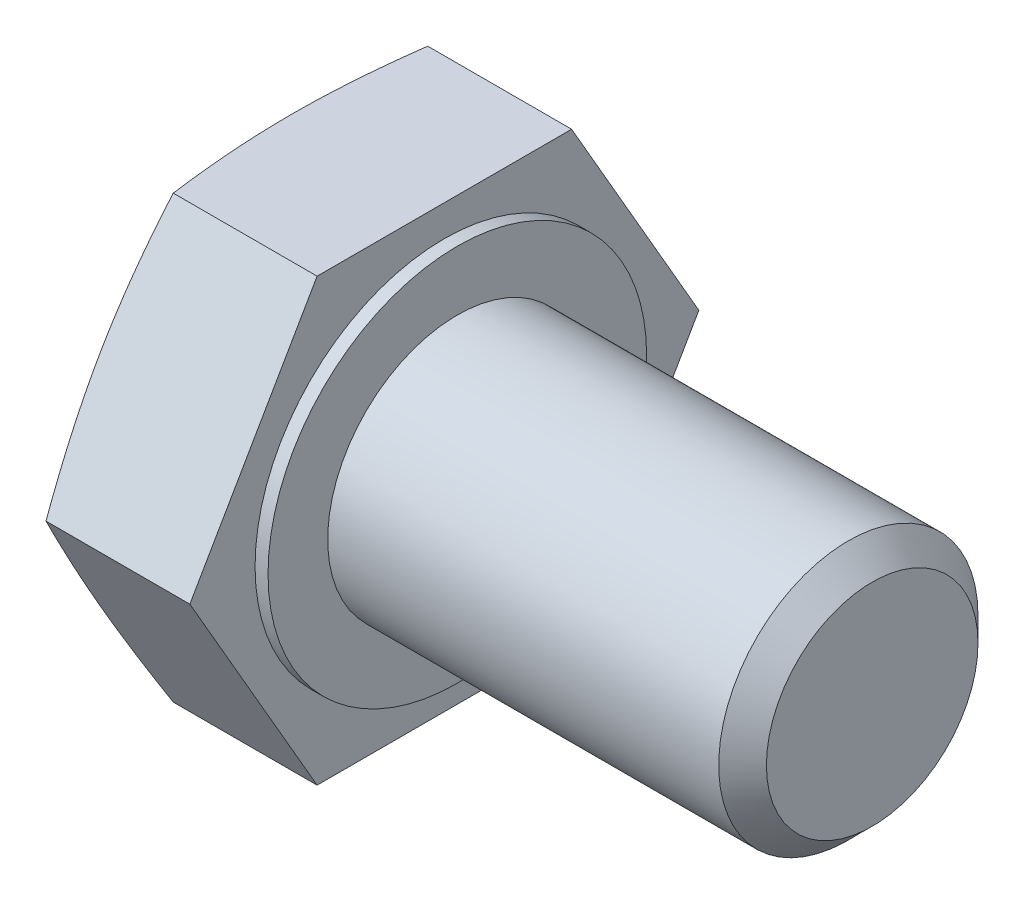
ISO-10303-21;
HEADER;
FILE_DESCRIPTION(('STEP AP214'),'2;1');
FILE_NAME('part.step','',(''),(''),'','','');
FILE_SCHEMA(('AUTOMOTIVE_DESIGN { 1 0 10303 214 1 1 1 1 }'));
ENDSEC;
DATA;
#1=APPLICATION_CONTEXT('core data for automotive mechanical design processes');
#2=APPLICATION_PROTOCOL_DEFINITION('international standard','automotive_design',2000,#1);
#3=PRODUCT_CONTEXT('',#1,'mechanical');
#4=PRODUCT('Part','Part','',(#3));
#5=PRODUCT_RELATED_PRODUCT_CATEGORY('part','',(#4));
#6=PRODUCT_DEFINITION_FORMATION('','',#4);
#7=PRODUCT_DEFINITION_CONTEXT('part definition',#1,'design');
#8=PRODUCT_DEFINITION('design','',#6,#7);
#9=PRODUCT_DEFINITION_SHAPE('','',#8);
#10=(LENGTH_UNIT() NAMED_UNIT(*) SI_UNIT(.MILLI.,.METRE.));
#11=(NAMED_UNIT(*) PLANE_ANGLE_UNIT() SI_UNIT($,.RADIAN.));
#12=(NAMED_UNIT(*) SI_UNIT($,.STERADIAN.) SOLID_ANGLE_UNIT());
#13=UNCERTAINTY_MEASURE_WITH_UNIT(LENGTH_MEASURE(1.E-05),#10,'distance_accuracy_value','');
#14=(GEOMETRIC_REPRESENTATION_CONTEXT(3) GLOBAL_UNCERTAINTY_ASSIGNED_CONTEXT((#13)) GLOBAL_UNIT_ASSIGNED_CONTEXT((#10,
#11,#12)) REPRESENTATION_CONTEXT('',''));
#15=CARTESIAN_POINT('',(0.,0.,0.));
#16=DIRECTION('',(0.,0.,1.));
#17=DIRECTION('',(1.,0.,0.));
#18=AXIS2_PLACEMENT_3D('',#15,#16,#17);
#19=CARTESIAN_POINT('',(-6.4,0.,0.));
#20=DIRECTION('',(1.,0.,0.));
#21=DIRECTION('',(0.,0.,-1.));
#22=AXIS2_PLACEMENT_3D('',#19,#20,#21);
#23=CONICAL_SURFACE('',#22,8.5,1.30899693899575);
#24=CARTESIAN_POINT('',(-6.04765898321727,-8.5,4.90747728811182));
#25=CARTESIAN_POINT('',(-6.4,-8.5,2.2775681356645));
#26=CARTESIAN_POINT('',(-6.4,-8.5,0.));
#27=B_SPLINE_CURVE_WITH_KNOTS('',2,(#24,#25,#26),.UNSPECIFIED.,.F.,.F.,(3,3),(0.,1.),.UNSPECIFIED.);
#28=CARTESIAN_POINT('',(-6.04765898321727,-8.5,4.90747728811182));
#29=VERTEX_POINT('',#28);
#30=CARTESIAN_POINT('',(-6.4,-8.5,0.));
#31=VERTEX_POINT('',#30);
#32=EDGE_CURVE('E135',#29,#31,#27,.T.);
#33=ORIENTED_EDGE('',*,*,#32,.F.);
#34=CARTESIAN_POINT('',(-6.4,-4.25,7.36121593216773));
#35=CARTESIAN_POINT('',(-6.4,-6.22243186433654,6.22243186433484));
#36=CARTESIAN_POINT('',(-6.04765898321744,-8.5,4.90747728811182));
#37=B_SPLINE_CURVE_WITH_KNOTS('',2,(#34,#35,#36),.UNSPECIFIED.,.F.,.F.,(3,3),(0.,1.),.UNSPECIFIED.);
#38=CARTESIAN_POINT('',(-6.4,-4.25,7.36121593216773));
#39=VERTEX_POINT('',#38);
#40=EDGE_CURVE('E139',#39,#29,#37,.T.);
#41=ORIENTED_EDGE('',*,*,#40,.F.);
#42=CARTESIAN_POINT('',(-6.4,0.,0.));
#43=DIRECTION('',(1.,0.,0.));
#44=DIRECTION('',(0.,0.,-1.));
#45=AXIS2_PLACEMENT_3D('',#42,#43,#44);
#46=CIRCLE('',#45,8.5);
#47=EDGE_CURVE('E9',#39,#31,#46,.T.);
#48=ORIENTED_EDGE('',*,*,#47,.T.);
#49=EDGE_LOOP('',(#33,#41,#48));
#50=FACE_BOUND('',#49,.T.);
#51=ADVANCED_FACE('F15',(#50),#23,.T.);
#52=CARTESIAN_POINT('',(-6.4,0.,0.));
#53=DIRECTION('',(1.,0.,0.));
#54=DIRECTION('',(0.,1.,0.));
#55=AXIS2_PLACEMENT_3D('',#52,#53,#54);
#56=PLANE('',#55);
#57=CARTESIAN_POINT('',(-6.4,0.,0.));
#58=DIRECTION('',(1.,0.,0.));
#59=DIRECTION('',(0.,0.,-1.));
#60=AXIS2_PLACEMENT_3D('',#57,#58,#59);
#61=CIRCLE('',#60,8.5);
#62=CARTESIAN_POINT('',(-6.4,8.5,0.));
#63=VERTEX_POINT('',#62);
#64=CARTESIAN_POINT('',(-6.4,4.25,7.36121593216773));
#65=VERTEX_POINT('',#64);
#66=EDGE_CURVE('E199',#63,#65,#61,.T.);
#67=ORIENTED_EDGE('',*,*,#66,.F.);
#68=CARTESIAN_POINT('',(-6.4,0.,0.));
#69=DIRECTION('',(1.,0.,0.));
#70=DIRECTION('',(0.,0.,-1.));
#71=AXIS2_PLACEMENT_3D('',#68,#69,#70);
#72=CIRCLE('',#71,8.5);
#73=CARTESIAN_POINT('',(-6.4,4.25,-7.36121593216773));
#74=VERTEX_POINT('',#73);
#75=EDGE_CURVE('E25',#74,#63,#72,.T.);
#76=ORIENTED_EDGE('',*,*,#75,.F.);
#77=CARTESIAN_POINT('',(-6.4,0.,0.));
#78=DIRECTION('',(1.,0.,0.));
#79=DIRECTION('',(0.,0.,-1.));
#80=AXIS2_PLACEMENT_3D('',#77,#78,#79);
#81=CIRCLE('',#80,8.5);
#82=CARTESIAN_POINT('',(-6.4,-4.25,-7.36121593216773));
#83=VERTEX_POINT('',#82);
#84=EDGE_CURVE('E260',#83,#74,#81,.T.);
#85=ORIENTED_EDGE('',*,*,#84,.F.);
#86=CARTESIAN_POINT('',(-6.4,0.,0.));
#87=DIRECTION('',(1.,0.,0.));
#88=DIRECTION('',(0.,0.,-1.));
#89=AXIS2_PLACEMENT_3D('',#86,#87,#88);
#90=CIRCLE('',#89,8.5);
#91=EDGE_CURVE('E404',#31,#83,#90,.T.);
#92=ORIENTED_EDGE('',*,*,#91,.F.);
#93=ORIENTED_EDGE('',*,*,#47,.F.);
#94=CARTESIAN_POINT('',(-6.4,0.,0.));
#95=DIRECTION('',(1.,0.,0.));
#96=DIRECTION('',(0.,0.,-1.));
#97=AXIS2_PLACEMENT_3D('',#94,#95,#96);
#98=CIRCLE('',#97,8.5);
#99=EDGE_CURVE('E207',#65,#39,#98,.T.);
#100=ORIENTED_EDGE('',*,*,#99,.F.);
#101=EDGE_LOOP('',(#67,#76,#85,#92,#93,#100));
#102=FACE_BOUND('',#101,.T.);
#103=ADVANCED_FACE('F334',(#102),#56,.F.);
#104=CARTESIAN_POINT('',(-6.4,0.,0.));
#105=DIRECTION('',(1.,0.,0.));
#106=DIRECTION('',(0.,0.,-1.));
#107=AXIS2_PLACEMENT_3D('',#104,#105,#106);
#108=CONICAL_SURFACE('',#107,8.5,1.30899693899575);
#109=CARTESIAN_POINT('',(-6.4,4.25,-7.36121593216773));
#110=CARTESIAN_POINT('',(-6.4,6.22243186433654,-6.22243186433484));
#111=CARTESIAN_POINT('',(-6.04765898321744,8.5,-4.90747728811182));
#112=B_SPLINE_CURVE_WITH_KNOTS('',2,(#109,#110,#111),.UNSPECIFIED.,.F.,.F.,(3,3),(0.,1.),.UNSPECIFIED.);
#113=CARTESIAN_POINT('',(-6.04765898321727,8.5,-4.90747728811182));
#114=VERTEX_POINT('',#113);
#115=EDGE_CURVE('E298',#74,#114,#112,.T.);
#116=ORIENTED_EDGE('',*,*,#115,.F.);
#117=ORIENTED_EDGE('',*,*,#75,.T.);
#118=CARTESIAN_POINT('',(-6.04765898321727,8.5,-4.90747728811182));
#119=CARTESIAN_POINT('',(-6.4,8.5,-2.2775681356645));
#120=CARTESIAN_POINT('',(-6.4,8.5,0.));
#121=B_SPLINE_CURVE_WITH_KNOTS('',2,(#118,#119,#120),.UNSPECIFIED.,.F.,.F.,(3,3),(0.,1.),.UNSPECIFIED.);
#122=EDGE_CURVE('E268',#114,#63,#121,.T.);
#123=ORIENTED_EDGE('',*,*,#122,.F.);
#124=EDGE_LOOP('',(#116,#117,#123));
#125=FACE_BOUND('',#124,.T.);
#126=ADVANCED_FACE('F325',(#125),#108,.T.);
#127=CARTESIAN_POINT('',(-6.4,0.,0.));
#128=DIRECTION('',(1.,0.,0.));
#129=DIRECTION('',(0.,0.,-1.));
#130=AXIS2_PLACEMENT_3D('',#127,#128,#129);
#131=CONICAL_SURFACE('',#130,8.5,1.30899693899575);
#132=CARTESIAN_POINT('',(-6.4,-4.25,-7.36121593216773));
#133=CARTESIAN_POINT('',(-6.4,-2.27756813566346,-8.50000000000062));
#134=CARTESIAN_POINT('',(-6.04765898321744,0.,-9.81495457622364));
#135=B_SPLINE_CURVE_WITH_KNOTS('',2,(#132,#133,#134),.UNSPECIFIED.,.F.,.F.,(3,3),(0.,1.),.UNSPECIFIED.);
#136=CARTESIAN_POINT('',(-6.04765898321727,0.,-9.81495457622364));
#137=VERTEX_POINT('',#136);
#138=EDGE_CURVE('E418',#83,#137,#135,.T.);
#139=ORIENTED_EDGE('',*,*,#138,.F.);
#140=ORIENTED_EDGE('',*,*,#84,.T.);
#141=CARTESIAN_POINT('',(-6.04765898321744,0.,-9.81495457622364));
#142=CARTESIAN_POINT('',(-6.4,2.27756813566346,-8.50000000000063));
#143=CARTESIAN_POINT('',(-6.4,4.25,-7.36121593216773));
#144=B_SPLINE_CURVE_WITH_KNOTS('',2,(#141,#142,#143),.UNSPECIFIED.,.F.,.F.,(3,3),(0.,1.),.UNSPECIFIED.);
#145=EDGE_CURVE('E301',#137,#74,#144,.T.);
#146=ORIENTED_EDGE('',*,*,#145,.F.);
#147=EDGE_LOOP('',(#139,#140,#146));
#148=FACE_BOUND('',#147,.T.);
#149=ADVANCED_FACE('F160',(#148),#131,.T.);
#150=CARTESIAN_POINT('',(-6.4,0.,0.));
#151=DIRECTION('',(1.,0.,0.));
#152=DIRECTION('',(0.,0.,-1.));
#153=AXIS2_PLACEMENT_3D('',#150,#151,#152);
#154=CONICAL_SURFACE('',#153,8.5,1.30899693899575);
#155=CARTESIAN_POINT('',(-6.4,-8.5,0.));
#156=CARTESIAN_POINT('',(-6.4,-8.5,-2.27756813566453));
#157=CARTESIAN_POINT('',(-6.04765898321727,-8.5,-4.90747728811181));
#158=B_SPLINE_CURVE_WITH_KNOTS('',2,(#155,#156,#157),.UNSPECIFIED.,.F.,.F.,(3,3),(0.,1.),.UNSPECIFIED.);
#159=CARTESIAN_POINT('',(-6.04765898321727,-8.5,-4.90747728811182));
#160=VERTEX_POINT('',#159);
#161=EDGE_CURVE('E368',#31,#160,#158,.T.);
#162=ORIENTED_EDGE('',*,*,#161,.F.);
#163=ORIENTED_EDGE('',*,*,#91,.T.);
#164=CARTESIAN_POINT('',(-6.04765898321744,-8.5,-4.90747728811182));
#165=CARTESIAN_POINT('',(-6.4,-6.22243186433654,-6.22243186433483));
#166=CARTESIAN_POINT('',(-6.4,-4.25,-7.36121593216773));
#167=B_SPLINE_CURVE_WITH_KNOTS('',2,(#164,#165,#166),.UNSPECIFIED.,.F.,.F.,(3,3),(0.,1.),.UNSPECIFIED.);
#168=EDGE_CURVE('E376',#160,#83,#167,.T.);
#169=ORIENTED_EDGE('',*,*,#168,.F.);
#170=EDGE_LOOP('',(#162,#163,#169));
#171=FACE_BOUND('',#170,.T.);
#172=ADVANCED_FACE('F189',(#171),#154,.T.);
#173=CARTESIAN_POINT('',(-6.4,0.,0.));
#174=DIRECTION('',(1.,0.,0.));
#175=DIRECTION('',(0.,0.,-1.));
#176=AXIS2_PLACEMENT_3D('',#173,#174,#175);
#177=CONICAL_SURFACE('',#176,8.5,1.30899693899575);
#178=CARTESIAN_POINT('',(-6.4,4.25,7.36121593216773));
#179=CARTESIAN_POINT('',(-6.4,2.27756813566346,8.50000000000062));
#180=CARTESIAN_POINT('',(-6.04765898321744,0.,9.81495457622364));
#181=B_SPLINE_CURVE_WITH_KNOTS('',2,(#178,#179,#180),.UNSPECIFIED.,.F.,.F.,(3,3),(0.,1.),.UNSPECIFIED.);
#182=CARTESIAN_POINT('',(-6.04765898321727,0.,9.81495457622364));
#183=VERTEX_POINT('',#182);
#184=EDGE_CURVE('E458',#65,#183,#181,.T.);
#185=ORIENTED_EDGE('',*,*,#184,.F.);
#186=ORIENTED_EDGE('',*,*,#99,.T.);
#187=CARTESIAN_POINT('',(-6.04765898321744,0.,9.81495457622364));
#188=CARTESIAN_POINT('',(-6.4,-2.27756813566346,8.50000000000063));
#189=CARTESIAN_POINT('',(-6.4,-4.25,7.36121593216773));
#190=B_SPLINE_CURVE_WITH_KNOTS('',2,(#187,#188,#189),.UNSPECIFIED.,.F.,.F.,(3,3),(0.,1.),.UNSPECIFIED.);
#191=EDGE_CURVE('E38',#183,#39,#190,.T.);
#192=ORIENTED_EDGE('',*,*,#191,.F.);
#193=EDGE_LOOP('',(#185,#186,#192));
#194=FACE_BOUND('',#193,.T.);
#195=ADVANCED_FACE('F180',(#194),#177,.T.);
#196=CARTESIAN_POINT('',(-6.4,0.,0.));
#197=DIRECTION('',(1.,0.,0.));
#198=DIRECTION('',(0.,0.,-1.));
#199=AXIS2_PLACEMENT_3D('',#196,#197,#198);
#200=CONICAL_SURFACE('',#199,8.5,1.30899693899575);
#201=CARTESIAN_POINT('',(-6.4,8.5,0.));
#202=CARTESIAN_POINT('',(-6.4,8.5,2.27756813566453));
#203=CARTESIAN_POINT('',(-6.04765898321727,8.5,4.90747728811181));
#204=B_SPLINE_CURVE_WITH_KNOTS('',2,(#201,#202,#203),.UNSPECIFIED.,.F.,.F.,(3,3),(0.,1.),.UNSPECIFIED.);
#205=CARTESIAN_POINT('',(-6.04765898321727,8.5,4.90747728811182));
#206=VERTEX_POINT('',#205);
#207=EDGE_CURVE('E295',#63,#206,#204,.T.);
#208=ORIENTED_EDGE('',*,*,#207,.F.);
#209=ORIENTED_EDGE('',*,*,#66,.T.);
#210=CARTESIAN_POINT('',(-6.04765898321744,8.5,4.90747728811182));
#211=CARTESIAN_POINT('',(-6.4,6.22243186433654,6.22243186433483));
#212=CARTESIAN_POINT('',(-6.4,4.25,7.36121593216773));
#213=B_SPLINE_CURVE_WITH_KNOTS('',2,(#210,#211,#212),.UNSPECIFIED.,.F.,.F.,(3,3),(0.,1.),.UNSPECIFIED.);
#214=EDGE_CURVE('E215',#206,#65,#213,.T.);
#215=ORIENTED_EDGE('',*,*,#214,.F.);
#216=EDGE_LOOP('',(#208,#209,#215));
#217=FACE_BOUND('',#216,.T.);
#218=ADVANCED_FACE('F157',(#217),#200,.T.);
#219=CARTESIAN_POINT('',(0.,-8.5,4.90747728811182));
#220=DIRECTION('',(0.,-0.5,0.866025403784439));
#221=DIRECTION('',(-1.,0.,0.));
#222=AXIS2_PLACEMENT_3D('',#219,#220,#221);
#223=PLANE('',#222);
#224=ORIENTED_EDGE('',*,*,#191,.T.);
#225=ORIENTED_EDGE('',*,*,#40,.T.);
#226=DIRECTION('',(-1.,0.,0.));
#227=VECTOR('',#226,1.);
#228=CARTESIAN_POINT('',(0.,-8.5,4.90747728811182));
#229=LINE('',#228,#227);
#230=CARTESIAN_POINT('',(-0.5,-8.5,4.90747728811182));
#231=VERTEX_POINT('',#230);
#232=EDGE_CURVE('E372',#231,#29,#229,.T.);
#233=ORIENTED_EDGE('',*,*,#232,.F.);
#234=DIRECTION('',(0.,0.866025403784439,0.5));
#235=VECTOR('',#234,1.);
#236=CARTESIAN_POINT('',(-0.5,4.3375,12.3192113688336));
#237=LINE('',#236,#235);
#238=CARTESIAN_POINT('',(-0.5,0.,9.81495457622364));
#239=VERTEX_POINT('',#238);
#240=EDGE_CURVE('E117',#231,#239,#237,.T.);
#241=ORIENTED_EDGE('',*,*,#240,.T.);
#242=DIRECTION('',(-1.,0.,0.));
#243=VECTOR('',#242,1.);
#244=CARTESIAN_POINT('',(0.,0.,9.81495457622364));
#245=LINE('',#244,#243);
#246=EDGE_CURVE('E178',#239,#183,#245,.T.);
#247=ORIENTED_EDGE('',*,*,#246,.T.);
#248=EDGE_LOOP('',(#224,#225,#233,#241,#247));
#249=FACE_BOUND('',#248,.T.);
#250=ADVANCED_FACE('F146',(#249),#223,.T.);
#251=CARTESIAN_POINT('',(0.,0.,9.81495457622364));
#252=DIRECTION('',(0.,0.5,0.866025403784439));
#253=DIRECTION('',(1.,0.,0.));
#254=AXIS2_PLACEMENT_3D('',#251,#252,#253);
#255=PLANE('',#254);
#256=ORIENTED_EDGE('',*,*,#214,.T.);
#257=ORIENTED_EDGE('',*,*,#184,.T.);
#258=ORIENTED_EDGE('',*,*,#246,.F.);
#259=DIRECTION('',(0.,0.866025403784439,-0.5));
#260=VECTOR('',#259,1.);
#261=CARTESIAN_POINT('',(-0.5,12.8375,2.40322049550182));
#262=LINE('',#261,#260);
#263=CARTESIAN_POINT('',(-0.5,8.5,4.90747728811182));
#264=VERTEX_POINT('',#263);
#265=EDGE_CURVE('E123',#239,#264,#262,.T.);
#266=ORIENTED_EDGE('',*,*,#265,.T.);
#267=DIRECTION('',(-1.,0.,0.));
#268=VECTOR('',#267,1.);
#269=CARTESIAN_POINT('',(0.,8.5,4.90747728811182));
#270=LINE('',#269,#268);
#271=EDGE_CURVE('E231',#264,#206,#270,.T.);
#272=ORIENTED_EDGE('',*,*,#271,.T.);
#273=EDGE_LOOP('',(#256,#257,#258,#266,#272));
#274=FACE_BOUND('',#273,.T.);
#275=ADVANCED_FACE('F156',(#274),#255,.T.);
#276=CARTESIAN_POINT('',(0.,8.5,4.90747728811182));
#277=DIRECTION('',(0.,1.,0.));
#278=DIRECTION('',(1.,0.,0.));
#279=AXIS2_PLACEMENT_3D('',#276,#277,#278);
#280=PLANE('',#279);
#281=ORIENTED_EDGE('',*,*,#122,.T.);
#282=ORIENTED_EDGE('',*,*,#207,.T.);
#283=ORIENTED_EDGE('',*,*,#271,.F.);
#284=DIRECTION('',(0.,0.,-1.));
#285=VECTOR('',#284,1.);
#286=CARTESIAN_POINT('',(-0.5,8.5,0.));
#287=LINE('',#286,#285);
#288=CARTESIAN_POINT('',(-0.5,8.5,-4.90747728811182));
#289=VERTEX_POINT('',#288);
#290=EDGE_CURVE('E120',#264,#289,#287,.T.);
#291=ORIENTED_EDGE('',*,*,#290,.T.);
#292=DIRECTION('',(-1.,0.,0.));
#293=VECTOR('',#292,1.);
#294=CARTESIAN_POINT('',(0.,8.5,-4.90747728811182));
#295=LINE('',#294,#293);
#296=EDGE_CURVE('E297',#289,#114,#295,.T.);
#297=ORIENTED_EDGE('',*,*,#296,.T.);
#298=EDGE_LOOP('',(#281,#282,#283,#291,#297));
#299=FACE_BOUND('',#298,.T.);
#300=ADVANCED_FACE('F274',(#299),#280,.T.);
#301=CARTESIAN_POINT('',(0.,8.5,-4.90747728811182));
#302=DIRECTION('',(0.,0.5,-0.866025403784439));
#303=DIRECTION('',(-1.,0.,0.));
#304=AXIS2_PLACEMENT_3D('',#301,#302,#303);
#305=PLANE('',#304);
#306=ORIENTED_EDGE('',*,*,#145,.T.);
#307=ORIENTED_EDGE('',*,*,#115,.T.);
#308=ORIENTED_EDGE('',*,*,#296,.F.);
#309=DIRECTION('',(0.,-0.866025403784439,-0.5));
#310=VECTOR('',#309,1.);
#311=CARTESIAN_POINT('',(-0.5,12.8375,-2.40322049550182));
#312=LINE('',#311,#310);
#313=CARTESIAN_POINT('',(-0.5,0.,-9.81495457622364));
#314=VERTEX_POINT('',#313);
#315=EDGE_CURVE('E110',#289,#314,#312,.T.);
#316=ORIENTED_EDGE('',*,*,#315,.T.);
#317=DIRECTION('',(-1.,0.,0.));
#318=VECTOR('',#317,1.);
#319=CARTESIAN_POINT('',(0.,0.,-9.81495457622364));
#320=LINE('',#319,#318);
#321=EDGE_CURVE('E430',#314,#137,#320,.T.);
#322=ORIENTED_EDGE('',*,*,#321,.T.);
#323=EDGE_LOOP('',(#306,#307,#308,#316,#322));
#324=FACE_BOUND('',#323,.T.);
#325=ADVANCED_FACE('F244',(#324),#305,.T.);
#326=CARTESIAN_POINT('',(0.,0.,-9.81495457622364));
#327=DIRECTION('',(0.,-0.5,-0.866025403784439));
#328=DIRECTION('',(0.,-0.866025403784439,0.5));
#329=AXIS2_PLACEMENT_3D('',#326,#327,#328);
#330=PLANE('',#329);
#331=ORIENTED_EDGE('',*,*,#168,.T.);
#332=ORIENTED_EDGE('',*,*,#138,.T.);
#333=ORIENTED_EDGE('',*,*,#321,.F.);
#334=DIRECTION('',(0.,-0.866025403784439,0.5));
#335=VECTOR('',#334,1.);
#336=CARTESIAN_POINT('',(-0.5,4.3375,-12.3192113688336));
#337=LINE('',#336,#335);
#338=CARTESIAN_POINT('',(-0.5,-8.5,-4.90747728811182));
#339=VERTEX_POINT('',#338);
#340=EDGE_CURVE('E107',#314,#339,#337,.T.);
#341=ORIENTED_EDGE('',*,*,#340,.T.);
#342=DIRECTION('',(-1.,0.,0.));
#343=VECTOR('',#342,1.);
#344=CARTESIAN_POINT('',(0.,-8.5,-4.90747728811182));
#345=LINE('',#344,#343);
#346=EDGE_CURVE('E369',#339,#160,#345,.T.);
#347=ORIENTED_EDGE('',*,*,#346,.T.);
#348=EDGE_LOOP('',(#331,#332,#333,#341,#347));
#349=FACE_BOUND('',#348,.T.);
#350=ADVANCED_FACE('F283',(#349),#330,.T.);
#351=CARTESIAN_POINT('',(0.,-8.5,-4.90747728811182));
#352=DIRECTION('',(0.,-1.,0.));
#353=DIRECTION('',(0.,0.,-1.));
#354=AXIS2_PLACEMENT_3D('',#351,#352,#353);
#355=PLANE('',#354);
#356=ORIENTED_EDGE('',*,*,#32,.T.);
#357=ORIENTED_EDGE('',*,*,#161,.T.);
#358=ORIENTED_EDGE('',*,*,#346,.F.);
#359=DIRECTION('',(0.,0.,1.));
#360=VECTOR('',#359,1.);
#361=CARTESIAN_POINT('',(-0.5,-8.5,0.));
#362=LINE('',#361,#360);
#363=EDGE_CURVE('E113',#339,#231,#362,.T.);
#364=ORIENTED_EDGE('',*,*,#363,.T.);
#365=ORIENTED_EDGE('',*,*,#232,.T.);
#366=EDGE_LOOP('',(#356,#357,#358,#364,#365));
#367=FACE_BOUND('',#366,.T.);
#368=ADVANCED_FACE('F343',(#367),#355,.T.);
#369=CARTESIAN_POINT('',(16.,4.08,0.));
#370=DIRECTION('',(-1.,0.,0.));
#371=DIRECTION('',(0.,0.,1.));
#372=AXIS2_PLACEMENT_3D('',#369,#370,#371);
#373=PLANE('',#372);
#374=CARTESIAN_POINT('',(16.,0.,0.));
#375=DIRECTION('',(1.,0.,0.));
#376=DIRECTION('',(0.,0.,-1.));
#377=AXIS2_PLACEMENT_3D('',#374,#375,#376);
#378=CIRCLE('',#377,4.08);
#379=CARTESIAN_POINT('',(16.,0.,-4.08));
#380=VERTEX_POINT('',#379);
#381=EDGE_CURVE('E133',#380,#380,#378,.T.);
#382=ORIENTED_EDGE('',*,*,#381,.T.);
#383=EDGE_LOOP('',(#382));
#384=FACE_BOUND('',#383,.T.);
#385=ADVANCED_FACE('F346',(#384),#373,.F.);
#386=CARTESIAN_POINT('',(15.08,0.,0.));
#387=DIRECTION('',(-1.,0.,0.));
#388=DIRECTION('',(0.,0.,1.));
#389=AXIS2_PLACEMENT_3D('',#386,#387,#388);
#390=CONICAL_SURFACE('',#389,5.,0.785398163397447);
#391=CARTESIAN_POINT('',(15.08,0.,0.));
#392=DIRECTION('',(1.,0.,0.));
#393=DIRECTION('',(0.,0.,-1.));
#394=AXIS2_PLACEMENT_3D('',#391,#392,#393);
#395=CIRCLE('',#394,5.);
#396=CARTESIAN_POINT('',(15.08,0.,-5.));
#397=VERTEX_POINT('',#396);
#398=EDGE_CURVE('E128',#397,#397,#395,.T.);
#399=ORIENTED_EDGE('',*,*,#398,.T.);
#400=EDGE_LOOP('',(#399));
#401=FACE_BOUND('',#400,.T.);
#402=ORIENTED_EDGE('',*,*,#381,.F.);
#403=EDGE_LOOP('',(#402));
#404=FACE_BOUND('',#403,.T.);
#405=ADVANCED_FACE('F242',(#401,#404),#390,.T.);
#406=CARTESIAN_POINT('',(16.,0.,0.));
#407=DIRECTION('',(1.,0.,0.));
#408=DIRECTION('',(0.,0.,-1.));
#409=AXIS2_PLACEMENT_3D('',#406,#407,#408);
#410=CYLINDRICAL_SURFACE('',#409,5.);
#411=CARTESIAN_POINT('',(0.,0.,0.));
#412=DIRECTION('',(1.,0.,0.));
#413=DIRECTION('',(0.,0.,-1.));
#414=AXIS2_PLACEMENT_3D('',#411,#412,#413);
#415=CIRCLE('',#414,5.);
#416=CARTESIAN_POINT('',(0.,0.,-5.));
#417=VERTEX_POINT('',#416);
#418=EDGE_CURVE('E126',#417,#417,#415,.T.);
#419=ORIENTED_EDGE('',*,*,#418,.T.);
#420=EDGE_LOOP('',(#419));
#421=FACE_BOUND('',#420,.T.);
#422=ORIENTED_EDGE('',*,*,#398,.F.);
#423=EDGE_LOOP('',(#422));
#424=FACE_BOUND('',#423,.T.);
#425=ADVANCED_FACE('F341',(#421,#424),#410,.T.);
#426=CARTESIAN_POINT('',(0.,7.3,0.));
#427=DIRECTION('',(-1.,0.,0.));
#428=DIRECTION('',(0.,0.,1.));
#429=AXIS2_PLACEMENT_3D('',#426,#427,#428);
#430=PLANE('',#429);
#431=CARTESIAN_POINT('',(0.,0.,0.));
#432=DIRECTION('',(1.,0.,0.));
#433=DIRECTION('',(0.,0.,-1.));
#434=AXIS2_PLACEMENT_3D('',#431,#432,#433);
#435=CIRCLE('',#434,7.3);
#436=CARTESIAN_POINT('',(0.,0.,-7.3));
#437=VERTEX_POINT('',#436);
#438=EDGE_CURVE('E116',#437,#437,#435,.T.);
#439=ORIENTED_EDGE('',*,*,#438,.T.);
#440=EDGE_LOOP('',(#439));
#441=FACE_BOUND('',#440,.T.);
#442=ORIENTED_EDGE('',*,*,#418,.F.);
#443=EDGE_LOOP('',(#442));
#444=FACE_BOUND('',#443,.T.);
#445=ADVANCED_FACE('F338',(#441,#444),#430,.F.);
#446=CARTESIAN_POINT('',(16.,0.,0.));
#447=DIRECTION('',(1.,0.,0.));
#448=DIRECTION('',(0.,0.,-1.));
#449=AXIS2_PLACEMENT_3D('',#446,#447,#448);
#450=CYLINDRICAL_SURFACE('',#449,7.3);
#451=CARTESIAN_POINT('',(-0.5,0.,0.));
#452=DIRECTION('',(1.,0.,0.));
#453=DIRECTION('',(0.,0.,-1.));
#454=AXIS2_PLACEMENT_3D('',#451,#452,#453);
#455=CIRCLE('',#454,7.3);
#456=CARTESIAN_POINT('',(-0.5,0.,-7.3));
#457=VERTEX_POINT('',#456);
#458=EDGE_CURVE('E103',#457,#457,#455,.T.);
#459=ORIENTED_EDGE('',*,*,#458,.T.);
#460=EDGE_LOOP('',(#459));
#461=FACE_BOUND('',#460,.T.);
#462=ORIENTED_EDGE('',*,*,#438,.F.);
#463=EDGE_LOOP('',(#462));
#464=FACE_BOUND('',#463,.T.);
#465=ADVANCED_FACE('F104',(#461,#464),#450,.T.);
#466=CARTESIAN_POINT('',(-0.5,11.45,0.));
#467=DIRECTION('',(-1.,0.,0.));
#468=DIRECTION('',(0.,0.,1.));
#469=AXIS2_PLACEMENT_3D('',#466,#467,#468);
#470=PLANE('',#469);
#471=ORIENTED_EDGE('',*,*,#340,.F.);
#472=ORIENTED_EDGE('',*,*,#315,.F.);
#473=ORIENTED_EDGE('',*,*,#290,.F.);
#474=ORIENTED_EDGE('',*,*,#265,.F.);
#475=ORIENTED_EDGE('',*,*,#240,.F.);
#476=ORIENTED_EDGE('',*,*,#363,.F.);
#477=EDGE_LOOP('',(#471,#472,#473,#474,#475,#476));
#478=FACE_BOUND('',#477,.T.);
#479=ORIENTED_EDGE('',*,*,#458,.F.);
#480=EDGE_LOOP('',(#479));
#481=FACE_BOUND('',#480,.T.);
#482=ADVANCED_FACE('F190',(#478,#481),#470,.F.);
#483=CLOSED_SHELL('',(#51,#103,#126,#149,#172,#195,#218,#250,#275,#300,#325,#350,#368,#385,#405,
#425,#445,#465,#482));
#484=MANIFOLD_SOLID_BREP('B1',#483);
#485=ADVANCED_BREP_SHAPE_REPRESENTATION('',(#18,#484),#14);
#486=SHAPE_DEFINITION_REPRESENTATION(#9,#485);
ENDSEC;
END-ISO-10303-21;
